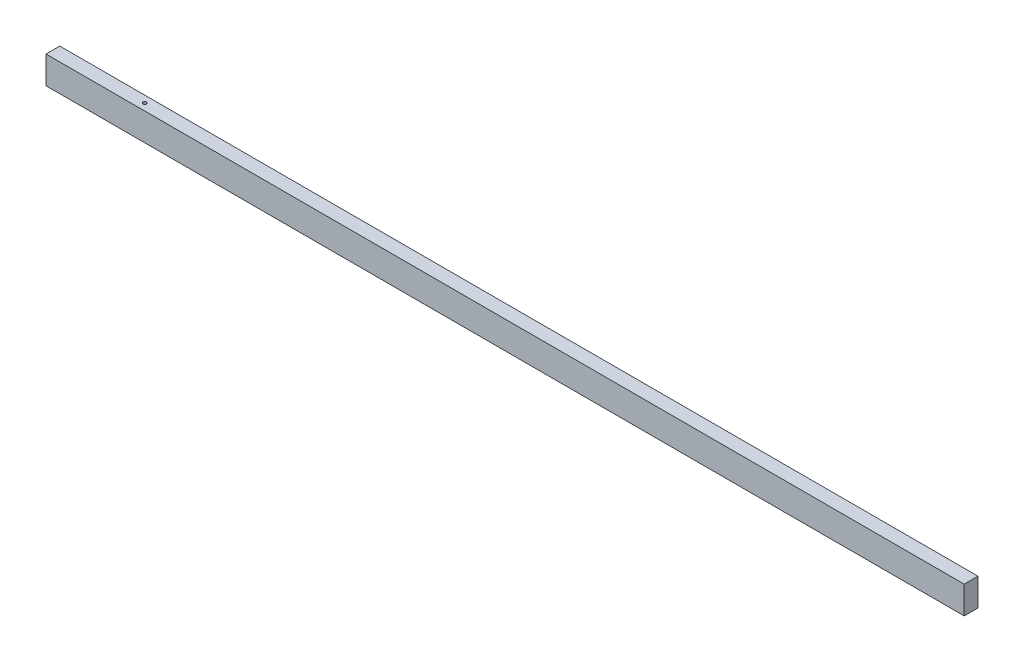
ISO-10303-21;
HEADER;
FILE_DESCRIPTION(('STEP AP214'),'2;1');
FILE_NAME('part.step','',(''),(''),'','','');
FILE_SCHEMA(('AUTOMOTIVE_DESIGN { 1 0 10303 214 1 1 1 1 }'));
ENDSEC;
DATA;
#1=APPLICATION_CONTEXT('core data for automotive mechanical design processes');
#2=APPLICATION_PROTOCOL_DEFINITION('international standard','automotive_design',2000,#1);
#3=PRODUCT_CONTEXT('',#1,'mechanical');
#4=PRODUCT('Part','Part','',(#3));
#5=PRODUCT_RELATED_PRODUCT_CATEGORY('part','',(#4));
#6=PRODUCT_DEFINITION_FORMATION('','',#4);
#7=PRODUCT_DEFINITION_CONTEXT('part definition',#1,'design');
#8=PRODUCT_DEFINITION('design','',#6,#7);
#9=PRODUCT_DEFINITION_SHAPE('','',#8);
#10=(LENGTH_UNIT() NAMED_UNIT(*) SI_UNIT(.MILLI.,.METRE.));
#11=(NAMED_UNIT(*) PLANE_ANGLE_UNIT() SI_UNIT($,.RADIAN.));
#12=(NAMED_UNIT(*) SI_UNIT($,.STERADIAN.) SOLID_ANGLE_UNIT());
#13=UNCERTAINTY_MEASURE_WITH_UNIT(LENGTH_MEASURE(1.E-05),#10,'distance_accuracy_value','');
#14=(GEOMETRIC_REPRESENTATION_CONTEXT(3) GLOBAL_UNCERTAINTY_ASSIGNED_CONTEXT((#13)) GLOBAL_UNIT_ASSIGNED_CONTEXT((#10,
#11,#12)) REPRESENTATION_CONTEXT('',''));
#15=CARTESIAN_POINT('',(0.,0.,0.));
#16=DIRECTION('',(0.,0.,1.));
#17=DIRECTION('',(1.,0.,0.));
#18=AXIS2_PLACEMENT_3D('',#15,#16,#17);
#19=CARTESIAN_POINT('',(0.,0.,15.));
#20=DIRECTION('',(1.,0.,0.));
#21=DIRECTION('',(0.,0.,-1.));
#22=AXIS2_PLACEMENT_3D('',#19,#20,#21);
#23=PLANE('',#22);
#24=DIRECTION('',(0.,-1.,0.));
#25=VECTOR('',#24,1.);
#26=CARTESIAN_POINT('',(0.,0.,0.));
#27=LINE('',#26,#25);
#28=CARTESIAN_POINT('',(0.,30.,0.));
#29=VERTEX_POINT('',#28);
#30=CARTESIAN_POINT('',(0.,0.,0.));
#31=VERTEX_POINT('',#30);
#32=EDGE_CURVE('E109',#29,#31,#27,.T.);
#33=ORIENTED_EDGE('',*,*,#32,.T.);
#34=DIRECTION('',(0.,0.,-1.));
#35=VECTOR('',#34,1.);
#36=CARTESIAN_POINT('',(0.,0.,15.));
#37=LINE('',#36,#35);
#38=CARTESIAN_POINT('',(0.,0.,15.));
#39=VERTEX_POINT('',#38);
#40=EDGE_CURVE('E11',#39,#31,#37,.T.);
#41=ORIENTED_EDGE('',*,*,#40,.F.);
#42=DIRECTION('',(0.,-1.,0.));
#43=VECTOR('',#42,1.);
#44=CARTESIAN_POINT('',(0.,0.,15.));
#45=LINE('',#44,#43);
#46=CARTESIAN_POINT('',(0.,30.,15.));
#47=VERTEX_POINT('',#46);
#48=EDGE_CURVE('E96',#47,#39,#45,.T.);
#49=ORIENTED_EDGE('',*,*,#48,.F.);
#50=DIRECTION('',(0.,0.,-1.));
#51=VECTOR('',#50,1.);
#52=CARTESIAN_POINT('',(0.,30.,15.));
#53=LINE('',#52,#51);
#54=EDGE_CURVE('E106',#47,#29,#53,.T.);
#55=ORIENTED_EDGE('',*,*,#54,.T.);
#56=EDGE_LOOP('',(#33,#41,#49,#55));
#57=FACE_BOUND('',#56,.T.);
#58=ADVANCED_FACE('F50',(#57),#23,.F.);
#59=CARTESIAN_POINT('',(0.,0.,15.));
#60=DIRECTION('',(0.,1.,0.));
#61=DIRECTION('',(0.,0.,1.));
#62=AXIS2_PLACEMENT_3D('',#59,#60,#61);
#63=PLANE('',#62);
#64=CARTESIAN_POINT('',(99.9999999999989,0.,7.49999999999984));
#65=DIRECTION('',(0.,1.,0.));
#66=DIRECTION('',(0.,0.,1.));
#67=AXIS2_PLACEMENT_3D('',#64,#65,#66);
#68=CIRCLE('',#67,1.90499999999998);
#69=CARTESIAN_POINT('',(99.9999999999989,0.,9.40499999999982));
#70=VERTEX_POINT('',#69);
#71=EDGE_CURVE('E113',#70,#70,#68,.T.);
#72=ORIENTED_EDGE('',*,*,#71,.T.);
#73=EDGE_LOOP('',(#72));
#74=FACE_BOUND('',#73,.T.);
#75=DIRECTION('',(1.,0.,0.));
#76=VECTOR('',#75,1.);
#77=CARTESIAN_POINT('',(0.,0.,0.));
#78=LINE('',#77,#76);
#79=CARTESIAN_POINT('',(1000.,0.,0.));
#80=VERTEX_POINT('',#79);
#81=EDGE_CURVE('E105',#31,#80,#78,.T.);
#82=ORIENTED_EDGE('',*,*,#81,.T.);
#83=DIRECTION('',(0.,0.,-1.));
#84=VECTOR('',#83,1.);
#85=CARTESIAN_POINT('',(1000.,0.,15.));
#86=LINE('',#85,#84);
#87=CARTESIAN_POINT('',(1000.,0.,15.));
#88=VERTEX_POINT('',#87);
#89=EDGE_CURVE('E54',#88,#80,#86,.T.);
#90=ORIENTED_EDGE('',*,*,#89,.F.);
#91=DIRECTION('',(1.,0.,0.));
#92=VECTOR('',#91,1.);
#93=CARTESIAN_POINT('',(0.,0.,15.));
#94=LINE('',#93,#92);
#95=EDGE_CURVE('E92',#39,#88,#94,.T.);
#96=ORIENTED_EDGE('',*,*,#95,.F.);
#97=ORIENTED_EDGE('',*,*,#40,.T.);
#98=EDGE_LOOP('',(#82,#90,#96,#97));
#99=FACE_BOUND('',#98,.T.);
#100=ADVANCED_FACE('F103',(#74,#99),#63,.F.);
#101=CARTESIAN_POINT('',(1000.,0.,15.));
#102=DIRECTION('',(-1.,0.,0.));
#103=DIRECTION('',(0.,0.,1.));
#104=AXIS2_PLACEMENT_3D('',#101,#102,#103);
#105=PLANE('',#104);
#106=DIRECTION('',(0.,1.,0.));
#107=VECTOR('',#106,1.);
#108=CARTESIAN_POINT('',(1000.,0.,0.));
#109=LINE('',#108,#107);
#110=CARTESIAN_POINT('',(1000.,30.,0.));
#111=VERTEX_POINT('',#110);
#112=EDGE_CURVE('E78',#80,#111,#109,.T.);
#113=ORIENTED_EDGE('',*,*,#112,.T.);
#114=DIRECTION('',(0.,0.,-1.));
#115=VECTOR('',#114,1.);
#116=CARTESIAN_POINT('',(1000.,30.,15.));
#117=LINE('',#116,#115);
#118=CARTESIAN_POINT('',(1000.,30.,15.));
#119=VERTEX_POINT('',#118);
#120=EDGE_CURVE('E101',#119,#111,#117,.T.);
#121=ORIENTED_EDGE('',*,*,#120,.F.);
#122=DIRECTION('',(0.,1.,0.));
#123=VECTOR('',#122,1.);
#124=CARTESIAN_POINT('',(1000.,0.,15.));
#125=LINE('',#124,#123);
#126=EDGE_CURVE('E98',#88,#119,#125,.T.);
#127=ORIENTED_EDGE('',*,*,#126,.F.);
#128=ORIENTED_EDGE('',*,*,#89,.T.);
#129=EDGE_LOOP('',(#113,#121,#127,#128));
#130=FACE_BOUND('',#129,.T.);
#131=ADVANCED_FACE('F104',(#130),#105,.F.);
#132=CARTESIAN_POINT('',(0.,30.,15.));
#133=DIRECTION('',(0.,-1.,0.));
#134=DIRECTION('',(0.,0.,-1.));
#135=AXIS2_PLACEMENT_3D('',#132,#133,#134);
#136=PLANE('',#135);
#137=CARTESIAN_POINT('',(99.9999999999989,30.,7.49999999999984));
#138=DIRECTION('',(0.,1.,0.));
#139=DIRECTION('',(0.,0.,1.));
#140=AXIS2_PLACEMENT_3D('',#137,#138,#139);
#141=CIRCLE('',#140,1.90499999999999);
#142=CARTESIAN_POINT('',(99.9999999999989,30.,9.40499999999983));
#143=VERTEX_POINT('',#142);
#144=EDGE_CURVE('E127',#143,#143,#141,.T.);
#145=ORIENTED_EDGE('',*,*,#144,.F.);
#146=EDGE_LOOP('',(#145));
#147=FACE_BOUND('',#146,.T.);
#148=DIRECTION('',(-1.,0.,0.));
#149=VECTOR('',#148,1.);
#150=CARTESIAN_POINT('',(0.,30.,0.));
#151=LINE('',#150,#149);
#152=EDGE_CURVE('E86',#111,#29,#151,.T.);
#153=ORIENTED_EDGE('',*,*,#152,.T.);
#154=ORIENTED_EDGE('',*,*,#54,.F.);
#155=DIRECTION('',(-1.,0.,0.));
#156=VECTOR('',#155,1.);
#157=CARTESIAN_POINT('',(0.,30.,15.));
#158=LINE('',#157,#156);
#159=EDGE_CURVE('E64',#119,#47,#158,.T.);
#160=ORIENTED_EDGE('',*,*,#159,.F.);
#161=ORIENTED_EDGE('',*,*,#120,.T.);
#162=EDGE_LOOP('',(#153,#154,#160,#161));
#163=FACE_BOUND('',#162,.T.);
#164=ADVANCED_FACE('F117',(#147,#163),#136,.F.);
#165=CARTESIAN_POINT('',(0.,0.,15.));
#166=DIRECTION('',(0.,0.,-1.));
#167=DIRECTION('',(-1.,0.,0.));
#168=AXIS2_PLACEMENT_3D('',#165,#166,#167);
#169=PLANE('',#168);
#170=ORIENTED_EDGE('',*,*,#48,.T.);
#171=ORIENTED_EDGE('',*,*,#95,.T.);
#172=ORIENTED_EDGE('',*,*,#126,.T.);
#173=ORIENTED_EDGE('',*,*,#159,.T.);
#174=EDGE_LOOP('',(#170,#171,#172,#173));
#175=FACE_BOUND('',#174,.T.);
#176=ADVANCED_FACE('F95',(#175),#169,.F.);
#177=CARTESIAN_POINT('',(0.,0.,0.));
#178=DIRECTION('',(0.,0.,-1.));
#179=DIRECTION('',(-1.,0.,0.));
#180=AXIS2_PLACEMENT_3D('',#177,#178,#179);
#181=PLANE('',#180);
#182=ORIENTED_EDGE('',*,*,#32,.F.);
#183=ORIENTED_EDGE('',*,*,#152,.F.);
#184=ORIENTED_EDGE('',*,*,#112,.F.);
#185=ORIENTED_EDGE('',*,*,#81,.F.);
#186=EDGE_LOOP('',(#182,#183,#184,#185));
#187=FACE_BOUND('',#186,.T.);
#188=ADVANCED_FACE('F122',(#187),#181,.T.);
#189=CARTESIAN_POINT('',(99.9999999999989,30.,7.49999999999984));
#190=DIRECTION('',(0.,1.,0.));
#191=DIRECTION('',(0.,0.,1.));
#192=AXIS2_PLACEMENT_3D('',#189,#190,#191);
#193=CYLINDRICAL_SURFACE('',#192,1.90499999999998);
#194=ORIENTED_EDGE('',*,*,#144,.T.);
#195=EDGE_LOOP('',(#194));
#196=FACE_BOUND('',#195,.T.);
#197=ORIENTED_EDGE('',*,*,#71,.F.);
#198=EDGE_LOOP('',(#197));
#199=FACE_BOUND('',#198,.T.);
#200=ADVANCED_FACE('F128',(#196,#199),#193,.F.);
#201=CLOSED_SHELL('',(#58,#100,#131,#164,#176,#188,#200));
#202=MANIFOLD_SOLID_BREP('B2',#201);
#203=ADVANCED_BREP_SHAPE_REPRESENTATION('',(#18,#202),#14);
#204=SHAPE_DEFINITION_REPRESENTATION(#9,#203);
ENDSEC;
END-ISO-10303-21;
